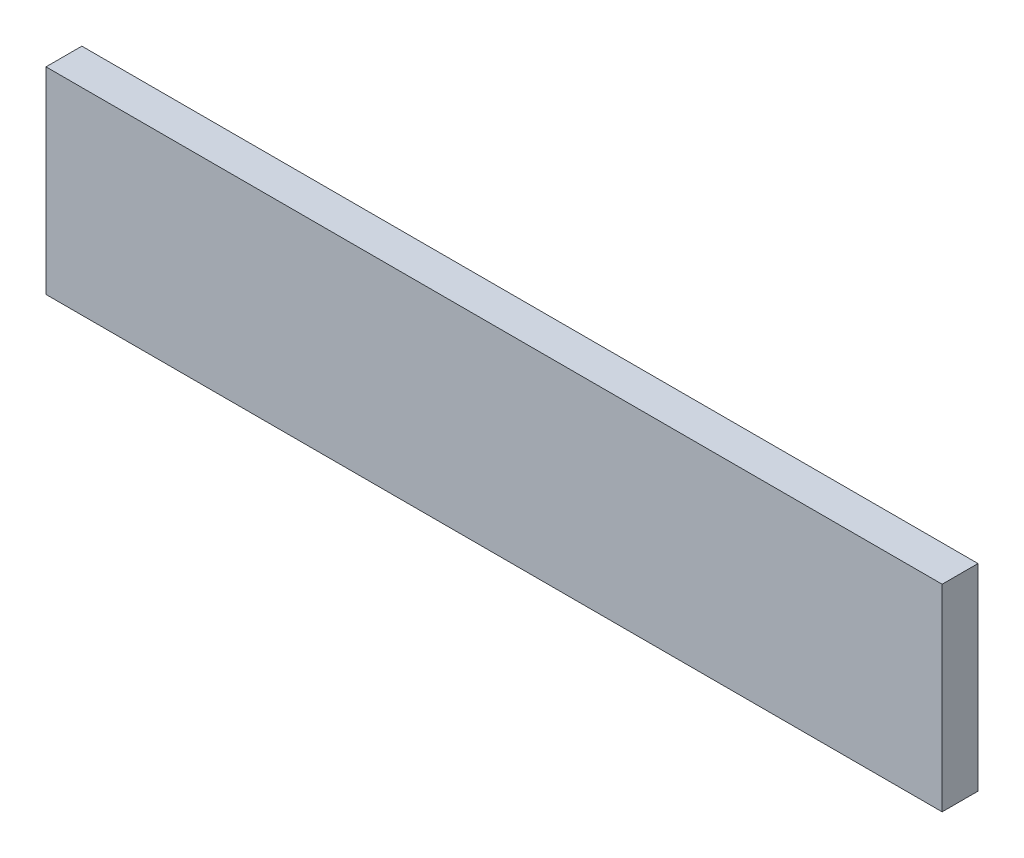
ISO-10303-21;
HEADER;
FILE_DESCRIPTION(('STEP AP214'),'2;1');
FILE_NAME('part.step','',(''),(''),'','','');
FILE_SCHEMA(('AUTOMOTIVE_DESIGN { 1 0 10303 214 1 1 1 1 }'));
ENDSEC;
DATA;
#1=APPLICATION_CONTEXT('core data for automotive mechanical design processes');
#2=APPLICATION_PROTOCOL_DEFINITION('international standard','automotive_design',2000,#1);
#3=PRODUCT_CONTEXT('',#1,'mechanical');
#4=PRODUCT('Part','Part','',(#3));
#5=PRODUCT_RELATED_PRODUCT_CATEGORY('part','',(#4));
#6=PRODUCT_DEFINITION_FORMATION('','',#4);
#7=PRODUCT_DEFINITION_CONTEXT('part definition',#1,'design');
#8=PRODUCT_DEFINITION('design','',#6,#7);
#9=PRODUCT_DEFINITION_SHAPE('','',#8);
#10=(LENGTH_UNIT() NAMED_UNIT(*) SI_UNIT(.MILLI.,.METRE.));
#11=(NAMED_UNIT(*) PLANE_ANGLE_UNIT() SI_UNIT($,.RADIAN.));
#12=(NAMED_UNIT(*) SI_UNIT($,.STERADIAN.) SOLID_ANGLE_UNIT());
#13=UNCERTAINTY_MEASURE_WITH_UNIT(LENGTH_MEASURE(1.E-05),#10,'distance_accuracy_value','');
#14=(GEOMETRIC_REPRESENTATION_CONTEXT(3) GLOBAL_UNCERTAINTY_ASSIGNED_CONTEXT((#13)) GLOBAL_UNIT_ASSIGNED_CONTEXT((#10,
#11,#12)) REPRESENTATION_CONTEXT('',''));
#15=CARTESIAN_POINT('',(0.,0.,0.));
#16=DIRECTION('',(0.,0.,1.));
#17=DIRECTION('',(1.,0.,0.));
#18=AXIS2_PLACEMENT_3D('',#15,#16,#17);
#19=CARTESIAN_POINT('',(125.,27.5,10.));
#20=DIRECTION('',(-1.,0.,0.));
#21=DIRECTION('',(0.,0.,1.));
#22=AXIS2_PLACEMENT_3D('',#19,#20,#21);
#23=PLANE('',#22);
#24=DIRECTION('',(0.,1.,0.));
#25=VECTOR('',#24,1.);
#26=CARTESIAN_POINT('',(125.,27.5,0.));
#27=LINE('',#26,#25);
#28=CARTESIAN_POINT('',(125.,-27.5,0.));
#29=VERTEX_POINT('',#28);
#30=CARTESIAN_POINT('',(125.,27.5,0.));
#31=VERTEX_POINT('',#30);
#32=EDGE_CURVE('E110',#29,#31,#27,.T.);
#33=ORIENTED_EDGE('',*,*,#32,.T.);
#34=DIRECTION('',(0.,0.,-1.));
#35=VECTOR('',#34,1.);
#36=CARTESIAN_POINT('',(125.,27.5,10.));
#37=LINE('',#36,#35);
#38=CARTESIAN_POINT('',(125.,27.5,10.));
#39=VERTEX_POINT('',#38);
#40=EDGE_CURVE('E11',#39,#31,#37,.T.);
#41=ORIENTED_EDGE('',*,*,#40,.F.);
#42=DIRECTION('',(0.,1.,0.));
#43=VECTOR('',#42,1.);
#44=CARTESIAN_POINT('',(125.,27.5,10.));
#45=LINE('',#44,#43);
#46=CARTESIAN_POINT('',(125.,-27.5,10.));
#47=VERTEX_POINT('',#46);
#48=EDGE_CURVE('E93',#47,#39,#45,.T.);
#49=ORIENTED_EDGE('',*,*,#48,.F.);
#50=DIRECTION('',(0.,0.,-1.));
#51=VECTOR('',#50,1.);
#52=CARTESIAN_POINT('',(125.,-27.5,10.));
#53=LINE('',#52,#51);
#54=EDGE_CURVE('E106',#47,#29,#53,.T.);
#55=ORIENTED_EDGE('',*,*,#54,.T.);
#56=EDGE_LOOP('',(#33,#41,#49,#55));
#57=FACE_BOUND('',#56,.T.);
#58=ADVANCED_FACE('F41',(#57),#23,.F.);
#59=CARTESIAN_POINT('',(-125.,27.5,10.));
#60=DIRECTION('',(0.,-1.,0.));
#61=DIRECTION('',(0.,0.,-1.));
#62=AXIS2_PLACEMENT_3D('',#59,#60,#61);
#63=PLANE('',#62);
#64=DIRECTION('',(-1.,0.,0.));
#65=VECTOR('',#64,1.);
#66=CARTESIAN_POINT('',(-125.,27.5,0.));
#67=LINE('',#66,#65);
#68=CARTESIAN_POINT('',(-125.,27.5,0.));
#69=VERTEX_POINT('',#68);
#70=EDGE_CURVE('E98',#31,#69,#67,.T.);
#71=ORIENTED_EDGE('',*,*,#70,.T.);
#72=DIRECTION('',(0.,0.,-1.));
#73=VECTOR('',#72,1.);
#74=CARTESIAN_POINT('',(-125.,27.5,10.));
#75=LINE('',#74,#73);
#76=CARTESIAN_POINT('',(-125.,27.5,10.));
#77=VERTEX_POINT('',#76);
#78=EDGE_CURVE('E50',#77,#69,#75,.T.);
#79=ORIENTED_EDGE('',*,*,#78,.F.);
#80=DIRECTION('',(-1.,0.,0.));
#81=VECTOR('',#80,1.);
#82=CARTESIAN_POINT('',(-125.,27.5,10.));
#83=LINE('',#82,#81);
#84=EDGE_CURVE('E88',#39,#77,#83,.T.);
#85=ORIENTED_EDGE('',*,*,#84,.F.);
#86=ORIENTED_EDGE('',*,*,#40,.T.);
#87=EDGE_LOOP('',(#71,#79,#85,#86));
#88=FACE_BOUND('',#87,.T.);
#89=ADVANCED_FACE('F97',(#88),#63,.F.);
#90=CARTESIAN_POINT('',(-125.,27.5,10.));
#91=DIRECTION('',(1.,0.,0.));
#92=DIRECTION('',(0.,1.,0.));
#93=AXIS2_PLACEMENT_3D('',#90,#91,#92);
#94=PLANE('',#93);
#95=DIRECTION('',(0.,-1.,0.));
#96=VECTOR('',#95,1.);
#97=CARTESIAN_POINT('',(-125.,27.5,0.));
#98=LINE('',#97,#96);
#99=CARTESIAN_POINT('',(-125.,-27.5,0.));
#100=VERTEX_POINT('',#99);
#101=EDGE_CURVE('E75',#69,#100,#98,.T.);
#102=ORIENTED_EDGE('',*,*,#101,.T.);
#103=DIRECTION('',(0.,0.,-1.));
#104=VECTOR('',#103,1.);
#105=CARTESIAN_POINT('',(-125.,-27.5,10.));
#106=LINE('',#105,#104);
#107=CARTESIAN_POINT('',(-125.,-27.5,10.));
#108=VERTEX_POINT('',#107);
#109=EDGE_CURVE('E100',#108,#100,#106,.T.);
#110=ORIENTED_EDGE('',*,*,#109,.F.);
#111=DIRECTION('',(0.,-1.,0.));
#112=VECTOR('',#111,1.);
#113=CARTESIAN_POINT('',(-125.,27.5,10.));
#114=LINE('',#113,#112);
#115=EDGE_CURVE('E91',#77,#108,#114,.T.);
#116=ORIENTED_EDGE('',*,*,#115,.F.);
#117=ORIENTED_EDGE('',*,*,#78,.T.);
#118=EDGE_LOOP('',(#102,#110,#116,#117));
#119=FACE_BOUND('',#118,.T.);
#120=ADVANCED_FACE('F101',(#119),#94,.F.);
#121=CARTESIAN_POINT('',(-125.,-27.5,10.));
#122=DIRECTION('',(0.,1.,0.));
#123=DIRECTION('',(0.,0.,1.));
#124=AXIS2_PLACEMENT_3D('',#121,#122,#123);
#125=PLANE('',#124);
#126=DIRECTION('',(1.,0.,0.));
#127=VECTOR('',#126,1.);
#128=CARTESIAN_POINT('',(-125.,-27.5,0.));
#129=LINE('',#128,#127);
#130=EDGE_CURVE('E81',#100,#29,#129,.T.);
#131=ORIENTED_EDGE('',*,*,#130,.T.);
#132=ORIENTED_EDGE('',*,*,#54,.F.);
#133=DIRECTION('',(1.,0.,0.));
#134=VECTOR('',#133,1.);
#135=CARTESIAN_POINT('',(-125.,-27.5,10.));
#136=LINE('',#135,#134);
#137=EDGE_CURVE('E58',#108,#47,#136,.T.);
#138=ORIENTED_EDGE('',*,*,#137,.F.);
#139=ORIENTED_EDGE('',*,*,#109,.T.);
#140=EDGE_LOOP('',(#131,#132,#138,#139));
#141=FACE_BOUND('',#140,.T.);
#142=ADVANCED_FACE('F124',(#141),#125,.F.);
#143=CARTESIAN_POINT('',(0.,0.,10.));
#144=DIRECTION('',(0.,0.,1.));
#145=DIRECTION('',(1.,0.,0.));
#146=AXIS2_PLACEMENT_3D('',#143,#144,#145);
#147=PLANE('',#146);
#148=ORIENTED_EDGE('',*,*,#48,.T.);
#149=ORIENTED_EDGE('',*,*,#84,.T.);
#150=ORIENTED_EDGE('',*,*,#115,.T.);
#151=ORIENTED_EDGE('',*,*,#137,.T.);
#152=EDGE_LOOP('',(#148,#149,#150,#151));
#153=FACE_BOUND('',#152,.T.);
#154=ADVANCED_FACE('F89',(#153),#147,.T.);
#155=CARTESIAN_POINT('',(0.,0.,0.));
#156=DIRECTION('',(0.,0.,1.));
#157=DIRECTION('',(1.,0.,0.));
#158=AXIS2_PLACEMENT_3D('',#155,#156,#157);
#159=PLANE('',#158);
#160=ORIENTED_EDGE('',*,*,#32,.F.);
#161=ORIENTED_EDGE('',*,*,#130,.F.);
#162=ORIENTED_EDGE('',*,*,#101,.F.);
#163=ORIENTED_EDGE('',*,*,#70,.F.);
#164=EDGE_LOOP('',(#160,#161,#162,#163));
#165=FACE_BOUND('',#164,.T.);
#166=ADVANCED_FACE('F127',(#165),#159,.F.);
#167=CLOSED_SHELL('',(#58,#89,#120,#142,#154,#166));
#168=MANIFOLD_SOLID_BREP('B2',#167);
#169=ADVANCED_BREP_SHAPE_REPRESENTATION('',(#18,#168),#14);
#170=SHAPE_DEFINITION_REPRESENTATION(#9,#169);
ENDSEC;
END-ISO-10303-21;
